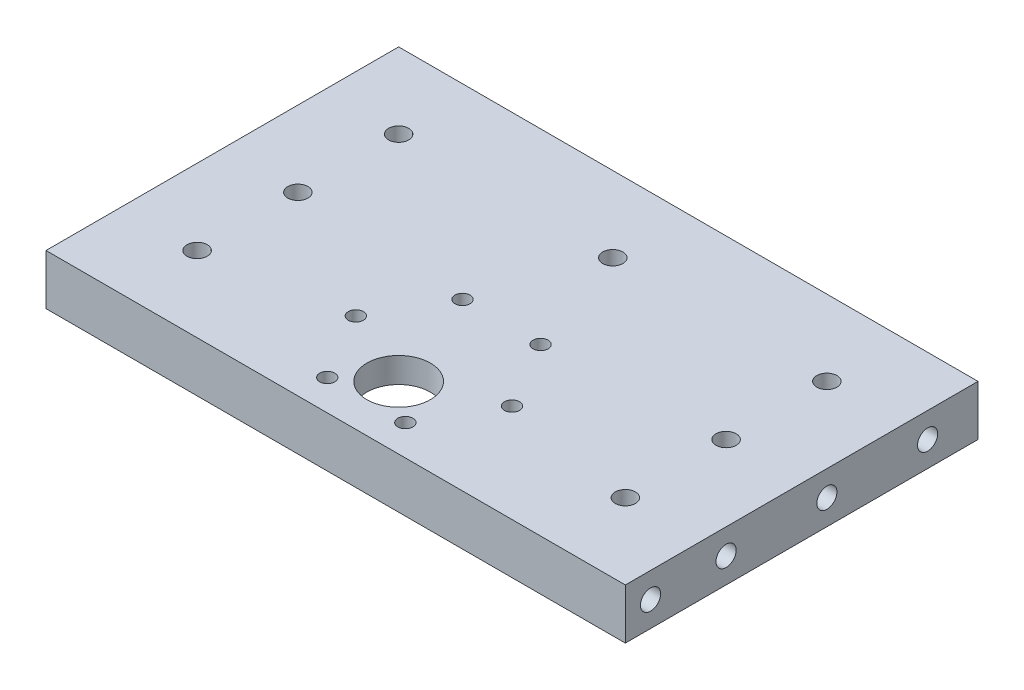
ISO-10303-21;
HEADER;
FILE_DESCRIPTION(('STEP AP214'),'2;1');
FILE_NAME('part.step','',(''),(''),'','','');
FILE_SCHEMA(('AUTOMOTIVE_DESIGN { 1 0 10303 214 1 1 1 1 }'));
ENDSEC;
DATA;
#1=APPLICATION_CONTEXT('core data for automotive mechanical design processes');
#2=APPLICATION_PROTOCOL_DEFINITION('international standard','automotive_design',2000,#1);
#3=PRODUCT_CONTEXT('',#1,'mechanical');
#4=PRODUCT('Part','Part','',(#3));
#5=PRODUCT_RELATED_PRODUCT_CATEGORY('part','',(#4));
#6=PRODUCT_DEFINITION_FORMATION('','',#4);
#7=PRODUCT_DEFINITION_CONTEXT('part definition',#1,'design');
#8=PRODUCT_DEFINITION('design','',#6,#7);
#9=PRODUCT_DEFINITION_SHAPE('','',#8);
#10=(LENGTH_UNIT() NAMED_UNIT(*) SI_UNIT(.MILLI.,.METRE.));
#11=(NAMED_UNIT(*) PLANE_ANGLE_UNIT() SI_UNIT($,.RADIAN.));
#12=(NAMED_UNIT(*) SI_UNIT($,.STERADIAN.) SOLID_ANGLE_UNIT());
#13=UNCERTAINTY_MEASURE_WITH_UNIT(LENGTH_MEASURE(1.E-05),#10,'distance_accuracy_value','');
#14=(GEOMETRIC_REPRESENTATION_CONTEXT(3) GLOBAL_UNCERTAINTY_ASSIGNED_CONTEXT((#13)) GLOBAL_UNIT_ASSIGNED_CONTEXT((#10,
#11,#12)) REPRESENTATION_CONTEXT('',''));
#15=CARTESIAN_POINT('',(0.,0.,0.));
#16=DIRECTION('',(0.,0.,1.));
#17=DIRECTION('',(1.,0.,0.));
#18=AXIS2_PLACEMENT_3D('',#15,#16,#17);
#19=CARTESIAN_POINT('',(0.,0.,22.5));
#20=DIRECTION('',(0.,1.,0.));
#21=DIRECTION('',(0.,0.,1.));
#22=AXIS2_PLACEMENT_3D('',#19,#20,#21);
#23=CYLINDRICAL_SURFACE('',#22,6.3);
#24=CARTESIAN_POINT('',(0.,10.,22.5));
#25=DIRECTION('',(0.,1.,0.));
#26=DIRECTION('',(0.,0.,1.));
#27=AXIS2_PLACEMENT_3D('',#24,#25,#26);
#28=CIRCLE('',#27,6.3);
#29=CARTESIAN_POINT('',(0.,10.,28.8));
#30=VERTEX_POINT('',#29);
#31=EDGE_CURVE('E102',#30,#30,#28,.T.);
#32=ORIENTED_EDGE('',*,*,#31,.T.);
#33=EDGE_LOOP('',(#32));
#34=FACE_BOUND('',#33,.T.);
#35=CARTESIAN_POINT('',(0.,5.,22.5));
#36=DIRECTION('',(0.,-1.,0.));
#37=DIRECTION('',(0.,0.,-1.));
#38=AXIS2_PLACEMENT_3D('',#35,#36,#37);
#39=CIRCLE('',#38,6.3);
#40=CARTESIAN_POINT('',(0.,5.,16.2));
#41=VERTEX_POINT('',#40);
#42=EDGE_CURVE('E120',#41,#41,#39,.F.);
#43=ORIENTED_EDGE('',*,*,#42,.F.);
#44=EDGE_LOOP('',(#43));
#45=FACE_BOUND('',#44,.T.);
#46=ADVANCED_FACE('F33',(#34,#45),#23,.F.);
#47=CARTESIAN_POINT('',(15.5,0.,15.5));
#48=DIRECTION('',(0.,1.,0.));
#49=DIRECTION('',(0.,0.,1.));
#50=AXIS2_PLACEMENT_3D('',#47,#48,#49);
#51=CYLINDRICAL_SURFACE('',#50,1.5);
#52=CARTESIAN_POINT('',(15.5,10.,15.5));
#53=DIRECTION('',(0.,1.,0.));
#54=DIRECTION('',(0.,0.,1.));
#55=AXIS2_PLACEMENT_3D('',#52,#53,#54);
#56=CIRCLE('',#55,1.5);
#57=CARTESIAN_POINT('',(15.5,10.,17.));
#58=VERTEX_POINT('',#57);
#59=EDGE_CURVE('E115',#58,#58,#56,.T.);
#60=ORIENTED_EDGE('',*,*,#59,.T.);
#61=EDGE_LOOP('',(#60));
#62=FACE_BOUND('',#61,.T.);
#63=CARTESIAN_POINT('',(15.5,5.,15.5));
#64=DIRECTION('',(0.,-1.,0.));
#65=DIRECTION('',(0.,0.,-1.));
#66=AXIS2_PLACEMENT_3D('',#63,#64,#65);
#67=CIRCLE('',#66,1.5);
#68=CARTESIAN_POINT('',(15.5,5.,14.));
#69=VERTEX_POINT('',#68);
#70=EDGE_CURVE('E136',#69,#69,#67,.F.);
#71=ORIENTED_EDGE('',*,*,#70,.F.);
#72=EDGE_LOOP('',(#71));
#73=FACE_BOUND('',#72,.T.);
#74=ADVANCED_FACE('F298',(#62,#73),#51,.F.);
#75=CARTESIAN_POINT('',(7.74999999999997,0.,28.9233937586588));
#76=DIRECTION('',(0.,1.,0.));
#77=DIRECTION('',(0.,0.,1.));
#78=AXIS2_PLACEMENT_3D('',#75,#76,#77);
#79=CYLINDRICAL_SURFACE('',#78,1.5);
#80=CARTESIAN_POINT('',(7.74999999999997,10.,28.9233937586588));
#81=DIRECTION('',(0.,1.,0.));
#82=DIRECTION('',(0.,0.,1.));
#83=AXIS2_PLACEMENT_3D('',#80,#81,#82);
#84=CIRCLE('',#83,1.5);
#85=CARTESIAN_POINT('',(7.74999999999997,10.,30.4233937586588));
#86=VERTEX_POINT('',#85);
#87=EDGE_CURVE('E129',#86,#86,#84,.T.);
#88=ORIENTED_EDGE('',*,*,#87,.T.);
#89=EDGE_LOOP('',(#88));
#90=FACE_BOUND('',#89,.T.);
#91=CARTESIAN_POINT('',(7.74999999999997,5.,28.9233937586588));
#92=DIRECTION('',(0.,-1.,0.));
#93=DIRECTION('',(0.,0.,-1.));
#94=AXIS2_PLACEMENT_3D('',#91,#92,#93);
#95=CIRCLE('',#94,1.5);
#96=CARTESIAN_POINT('',(7.74999999999997,5.,27.4233937586588));
#97=VERTEX_POINT('',#96);
#98=EDGE_CURVE('E139',#97,#97,#95,.F.);
#99=ORIENTED_EDGE('',*,*,#98,.F.);
#100=EDGE_LOOP('',(#99));
#101=FACE_BOUND('',#100,.T.);
#102=ADVANCED_FACE('F304',(#90,#101),#79,.F.);
#103=CARTESIAN_POINT('',(-7.75000000000006,0.,28.9233937586588));
#104=DIRECTION('',(0.,1.,0.));
#105=DIRECTION('',(0.,0.,1.));
#106=AXIS2_PLACEMENT_3D('',#103,#104,#105);
#107=CYLINDRICAL_SURFACE('',#106,1.5);
#108=CARTESIAN_POINT('',(-7.75000000000006,10.,28.9233937586588));
#109=DIRECTION('',(0.,1.,0.));
#110=DIRECTION('',(0.,0.,1.));
#111=AXIS2_PLACEMENT_3D('',#108,#109,#110);
#112=CIRCLE('',#111,1.5);
#113=CARTESIAN_POINT('',(-7.75000000000006,10.,30.4233937586588));
#114=VERTEX_POINT('',#113);
#115=EDGE_CURVE('E126',#114,#114,#112,.T.);
#116=ORIENTED_EDGE('',*,*,#115,.T.);
#117=EDGE_LOOP('',(#116));
#118=FACE_BOUND('',#117,.T.);
#119=CARTESIAN_POINT('',(-7.75000000000006,5.,28.9233937586588));
#120=DIRECTION('',(0.,-1.,0.));
#121=DIRECTION('',(0.,0.,-1.));
#122=AXIS2_PLACEMENT_3D('',#119,#120,#121);
#123=CIRCLE('',#122,1.5);
#124=CARTESIAN_POINT('',(-7.75000000000006,5.,27.4233937586588));
#125=VERTEX_POINT('',#124);
#126=EDGE_CURVE('E142',#125,#125,#123,.F.);
#127=ORIENTED_EDGE('',*,*,#126,.F.);
#128=EDGE_LOOP('',(#127));
#129=FACE_BOUND('',#128,.T.);
#130=ADVANCED_FACE('F466',(#118,#129),#107,.F.);
#131=CARTESIAN_POINT('',(-15.5,0.,15.4999999999999));
#132=DIRECTION('',(0.,1.,0.));
#133=DIRECTION('',(0.,0.,1.));
#134=AXIS2_PLACEMENT_3D('',#131,#132,#133);
#135=CYLINDRICAL_SURFACE('',#134,1.5);
#136=CARTESIAN_POINT('',(-15.5,10.,15.4999999999999));
#137=DIRECTION('',(0.,1.,0.));
#138=DIRECTION('',(0.,0.,1.));
#139=AXIS2_PLACEMENT_3D('',#136,#137,#138);
#140=CIRCLE('',#139,1.5);
#141=CARTESIAN_POINT('',(-15.5,10.,16.9999999999999));
#142=VERTEX_POINT('',#141);
#143=EDGE_CURVE('E123',#142,#142,#140,.T.);
#144=ORIENTED_EDGE('',*,*,#143,.T.);
#145=EDGE_LOOP('',(#144));
#146=FACE_BOUND('',#145,.T.);
#147=CARTESIAN_POINT('',(-15.5,5.,15.4999999999999));
#148=DIRECTION('',(0.,-1.,0.));
#149=DIRECTION('',(0.,0.,-1.));
#150=AXIS2_PLACEMENT_3D('',#147,#148,#149);
#151=CIRCLE('',#150,1.5);
#152=CARTESIAN_POINT('',(-15.5,5.,13.9999999999999));
#153=VERTEX_POINT('',#152);
#154=EDGE_CURVE('E145',#153,#153,#151,.F.);
#155=ORIENTED_EDGE('',*,*,#154,.F.);
#156=EDGE_LOOP('',(#155));
#157=FACE_BOUND('',#156,.T.);
#158=ADVANCED_FACE('F473',(#146,#157),#135,.F.);
#159=CARTESIAN_POINT('',(-7.74999999999987,0.,2.07660624134112));
#160=DIRECTION('',(0.,1.,0.));
#161=DIRECTION('',(0.,0.,1.));
#162=AXIS2_PLACEMENT_3D('',#159,#160,#161);
#163=CYLINDRICAL_SURFACE('',#162,1.5);
#164=CARTESIAN_POINT('',(-7.74999999999987,10.,2.07660624134112));
#165=DIRECTION('',(0.,1.,0.));
#166=DIRECTION('',(0.,0.,1.));
#167=AXIS2_PLACEMENT_3D('',#164,#165,#166);
#168=CIRCLE('',#167,1.5);
#169=CARTESIAN_POINT('',(-7.74999999999987,10.,3.57660624134112));
#170=VERTEX_POINT('',#169);
#171=EDGE_CURVE('E119',#170,#170,#168,.T.);
#172=ORIENTED_EDGE('',*,*,#171,.T.);
#173=EDGE_LOOP('',(#172));
#174=FACE_BOUND('',#173,.T.);
#175=CARTESIAN_POINT('',(-7.74999999999987,5.,2.07660624134112));
#176=DIRECTION('',(0.,-1.,0.));
#177=DIRECTION('',(0.,0.,-1.));
#178=AXIS2_PLACEMENT_3D('',#175,#176,#177);
#179=CIRCLE('',#178,1.5);
#180=CARTESIAN_POINT('',(-7.74999999999987,5.,0.576606241341121));
#181=VERTEX_POINT('',#180);
#182=EDGE_CURVE('E148',#181,#181,#179,.F.);
#183=ORIENTED_EDGE('',*,*,#182,.F.);
#184=EDGE_LOOP('',(#183));
#185=FACE_BOUND('',#184,.T.);
#186=ADVANCED_FACE('F327',(#174,#185),#163,.F.);
#187=CARTESIAN_POINT('',(7.75000000000016,0.,2.07660624134128));
#188=DIRECTION('',(0.,1.,0.));
#189=DIRECTION('',(0.,0.,1.));
#190=AXIS2_PLACEMENT_3D('',#187,#188,#189);
#191=CYLINDRICAL_SURFACE('',#190,1.5);
#192=CARTESIAN_POINT('',(7.75000000000016,10.,2.07660624134128));
#193=DIRECTION('',(0.,1.,0.));
#194=DIRECTION('',(0.,0.,1.));
#195=AXIS2_PLACEMENT_3D('',#192,#193,#194);
#196=CIRCLE('',#195,1.5);
#197=CARTESIAN_POINT('',(7.75000000000016,10.,3.57660624134128));
#198=VERTEX_POINT('',#197);
#199=EDGE_CURVE('E116',#198,#198,#196,.T.);
#200=ORIENTED_EDGE('',*,*,#199,.T.);
#201=EDGE_LOOP('',(#200));
#202=FACE_BOUND('',#201,.T.);
#203=CARTESIAN_POINT('',(7.75000000000016,5.,2.07660624134128));
#204=DIRECTION('',(0.,-1.,0.));
#205=DIRECTION('',(0.,0.,-1.));
#206=AXIS2_PLACEMENT_3D('',#203,#204,#205);
#207=CIRCLE('',#206,1.5);
#208=CARTESIAN_POINT('',(7.75000000000016,5.,0.576606241341277));
#209=VERTEX_POINT('',#208);
#210=EDGE_CURVE('E37',#209,#209,#207,.F.);
#211=ORIENTED_EDGE('',*,*,#210,.F.);
#212=EDGE_LOOP('',(#211));
#213=FACE_BOUND('',#212,.T.);
#214=ADVANCED_FACE('F309',(#202,#213),#191,.F.);
#215=CARTESIAN_POINT('',(-57.5,10.,-35.));
#216=DIRECTION('',(1.,0.,0.));
#217=DIRECTION('',(0.,0.,-1.));
#218=AXIS2_PLACEMENT_3D('',#215,#216,#217);
#219=PLANE('',#218);
#220=CARTESIAN_POINT('',(-57.5,5.00000000000001,30.));
#221=DIRECTION('',(-1.,0.,0.));
#222=DIRECTION('',(0.,0.,1.));
#223=AXIS2_PLACEMENT_3D('',#220,#221,#222);
#224=CIRCLE('',#223,2.00000000000001);
#225=CARTESIAN_POINT('',(-57.5,5.00000000000001,32.));
#226=VERTEX_POINT('',#225);
#227=EDGE_CURVE('E177',#226,#226,#224,.T.);
#228=ORIENTED_EDGE('',*,*,#227,.F.);
#229=EDGE_LOOP('',(#228));
#230=FACE_BOUND('',#229,.T.);
#231=CARTESIAN_POINT('',(-57.5,5.00000000000001,15.));
#232=DIRECTION('',(-1.,0.,0.));
#233=DIRECTION('',(0.,0.,1.));
#234=AXIS2_PLACEMENT_3D('',#231,#232,#233);
#235=CIRCLE('',#234,2.);
#236=CARTESIAN_POINT('',(-57.5,5.00000000000001,17.));
#237=VERTEX_POINT('',#236);
#238=EDGE_CURVE('E171',#237,#237,#235,.T.);
#239=ORIENTED_EDGE('',*,*,#238,.F.);
#240=EDGE_LOOP('',(#239));
#241=FACE_BOUND('',#240,.T.);
#242=CARTESIAN_POINT('',(-57.5,5.,-5.00000000000001));
#243=DIRECTION('',(-1.,0.,0.));
#244=DIRECTION('',(0.,0.,1.));
#245=AXIS2_PLACEMENT_3D('',#242,#243,#244);
#246=CIRCLE('',#245,2.);
#247=CARTESIAN_POINT('',(-57.5,5.,-3.00000000000001));
#248=VERTEX_POINT('',#247);
#249=EDGE_CURVE('E165',#248,#248,#246,.T.);
#250=ORIENTED_EDGE('',*,*,#249,.F.);
#251=EDGE_LOOP('',(#250));
#252=FACE_BOUND('',#251,.T.);
#253=CARTESIAN_POINT('',(-57.5,5.,-25.));
#254=DIRECTION('',(-1.,0.,0.));
#255=DIRECTION('',(0.,0.,1.));
#256=AXIS2_PLACEMENT_3D('',#253,#254,#255);
#257=CIRCLE('',#256,2.);
#258=CARTESIAN_POINT('',(-57.5,5.,-23.));
#259=VERTEX_POINT('',#258);
#260=EDGE_CURVE('E158',#259,#259,#257,.T.);
#261=ORIENTED_EDGE('',*,*,#260,.F.);
#262=EDGE_LOOP('',(#261));
#263=FACE_BOUND('',#262,.T.);
#264=DIRECTION('',(0.,0.,1.));
#265=VECTOR('',#264,1.);
#266=CARTESIAN_POINT('',(-57.5,0.,-35.));
#267=LINE('',#266,#265);
#268=CARTESIAN_POINT('',(-57.5,0.,-35.));
#269=VERTEX_POINT('',#268);
#270=CARTESIAN_POINT('',(-57.5,0.,35.));
#271=VERTEX_POINT('',#270);
#272=EDGE_CURVE('E99',#269,#271,#267,.T.);
#273=ORIENTED_EDGE('',*,*,#272,.T.);
#274=DIRECTION('',(0.,-1.,0.));
#275=VECTOR('',#274,1.);
#276=CARTESIAN_POINT('',(-57.5,10.,35.));
#277=LINE('',#276,#275);
#278=CARTESIAN_POINT('',(-57.5,10.,35.));
#279=VERTEX_POINT('',#278);
#280=EDGE_CURVE('E11',#279,#271,#277,.T.);
#281=ORIENTED_EDGE('',*,*,#280,.F.);
#282=DIRECTION('',(0.,0.,1.));
#283=VECTOR('',#282,1.);
#284=CARTESIAN_POINT('',(-57.5,10.,-35.));
#285=LINE('',#284,#283);
#286=CARTESIAN_POINT('',(-57.5,10.,-35.));
#287=VERTEX_POINT('',#286);
#288=EDGE_CURVE('E86',#287,#279,#285,.T.);
#289=ORIENTED_EDGE('',*,*,#288,.F.);
#290=DIRECTION('',(0.,-1.,0.));
#291=VECTOR('',#290,1.);
#292=CARTESIAN_POINT('',(-57.5,10.,-35.));
#293=LINE('',#292,#291);
#294=EDGE_CURVE('E95',#287,#269,#293,.T.);
#295=ORIENTED_EDGE('',*,*,#294,.T.);
#296=EDGE_LOOP('',(#273,#281,#289,#295));
#297=FACE_BOUND('',#296,.T.);
#298=ADVANCED_FACE('F35',(#230,#241,#252,#263,#297),#219,.F.);
#299=CARTESIAN_POINT('',(-57.5,10.,35.));
#300=DIRECTION('',(0.,0.,-1.));
#301=DIRECTION('',(-1.,0.,0.));
#302=AXIS2_PLACEMENT_3D('',#299,#300,#301);
#303=PLANE('',#302);
#304=DIRECTION('',(1.,0.,0.));
#305=VECTOR('',#304,1.);
#306=CARTESIAN_POINT('',(-57.5,0.,35.));
#307=LINE('',#306,#305);
#308=CARTESIAN_POINT('',(57.5,0.,35.));
#309=VERTEX_POINT('',#308);
#310=EDGE_CURVE('E90',#271,#309,#307,.T.);
#311=ORIENTED_EDGE('',*,*,#310,.T.);
#312=DIRECTION('',(0.,-1.,0.));
#313=VECTOR('',#312,1.);
#314=CARTESIAN_POINT('',(57.5,10.,35.));
#315=LINE('',#314,#313);
#316=CARTESIAN_POINT('',(57.5,10.,35.));
#317=VERTEX_POINT('',#316);
#318=EDGE_CURVE('E43',#317,#309,#315,.T.);
#319=ORIENTED_EDGE('',*,*,#318,.F.);
#320=DIRECTION('',(1.,0.,0.));
#321=VECTOR('',#320,1.);
#322=CARTESIAN_POINT('',(-57.5,10.,35.));
#323=LINE('',#322,#321);
#324=EDGE_CURVE('E81',#279,#317,#323,.T.);
#325=ORIENTED_EDGE('',*,*,#324,.F.);
#326=ORIENTED_EDGE('',*,*,#280,.T.);
#327=EDGE_LOOP('',(#311,#319,#325,#326));
#328=FACE_BOUND('',#327,.T.);
#329=ADVANCED_FACE('F89',(#328),#303,.F.);
#330=CARTESIAN_POINT('',(57.5,10.,-35.));
#331=DIRECTION('',(-1.,0.,0.));
#332=DIRECTION('',(0.,0.,1.));
#333=AXIS2_PLACEMENT_3D('',#330,#331,#332);
#334=PLANE('',#333);
#335=CARTESIAN_POINT('',(57.5,5.00000000000001,30.));
#336=DIRECTION('',(1.,0.,0.));
#337=DIRECTION('',(0.,0.,-1.));
#338=AXIS2_PLACEMENT_3D('',#335,#336,#337);
#339=CIRCLE('',#338,2.00000000000001);
#340=CARTESIAN_POINT('',(57.5,5.00000000000001,28.));
#341=VERTEX_POINT('',#340);
#342=EDGE_CURVE('E201',#341,#341,#339,.T.);
#343=ORIENTED_EDGE('',*,*,#342,.F.);
#344=EDGE_LOOP('',(#343));
#345=FACE_BOUND('',#344,.T.);
#346=CARTESIAN_POINT('',(57.5,5.00000000000001,15.));
#347=DIRECTION('',(1.,0.,0.));
#348=DIRECTION('',(0.,0.,-1.));
#349=AXIS2_PLACEMENT_3D('',#346,#347,#348);
#350=CIRCLE('',#349,2.);
#351=CARTESIAN_POINT('',(57.5,5.00000000000001,13.));
#352=VERTEX_POINT('',#351);
#353=EDGE_CURVE('E195',#352,#352,#350,.T.);
#354=ORIENTED_EDGE('',*,*,#353,.F.);
#355=EDGE_LOOP('',(#354));
#356=FACE_BOUND('',#355,.T.);
#357=CARTESIAN_POINT('',(57.5,5.,-5.00000000000002));
#358=DIRECTION('',(1.,0.,0.));
#359=DIRECTION('',(0.,0.,-1.));
#360=AXIS2_PLACEMENT_3D('',#357,#358,#359);
#361=CIRCLE('',#360,2.);
#362=CARTESIAN_POINT('',(57.5,5.,-7.00000000000002));
#363=VERTEX_POINT('',#362);
#364=EDGE_CURVE('E189',#363,#363,#361,.T.);
#365=ORIENTED_EDGE('',*,*,#364,.F.);
#366=EDGE_LOOP('',(#365));
#367=FACE_BOUND('',#366,.T.);
#368=CARTESIAN_POINT('',(57.5,5.,-25.));
#369=DIRECTION('',(1.,0.,0.));
#370=DIRECTION('',(0.,0.,-1.));
#371=AXIS2_PLACEMENT_3D('',#368,#369,#370);
#372=CIRCLE('',#371,2.);
#373=CARTESIAN_POINT('',(57.5,5.,-27.));
#374=VERTEX_POINT('',#373);
#375=EDGE_CURVE('E182',#374,#374,#372,.T.);
#376=ORIENTED_EDGE('',*,*,#375,.F.);
#377=EDGE_LOOP('',(#376));
#378=FACE_BOUND('',#377,.T.);
#379=DIRECTION('',(0.,0.,-1.));
#380=VECTOR('',#379,1.);
#381=CARTESIAN_POINT('',(57.5,0.,-35.));
#382=LINE('',#381,#380);
#383=CARTESIAN_POINT('',(57.5,0.,-35.));
#384=VERTEX_POINT('',#383);
#385=EDGE_CURVE('E68',#309,#384,#382,.T.);
#386=ORIENTED_EDGE('',*,*,#385,.T.);
#387=DIRECTION('',(0.,-1.,0.));
#388=VECTOR('',#387,1.);
#389=CARTESIAN_POINT('',(57.5,10.,-35.));
#390=LINE('',#389,#388);
#391=CARTESIAN_POINT('',(57.5,10.,-35.));
#392=VERTEX_POINT('',#391);
#393=EDGE_CURVE('E91',#392,#384,#390,.T.);
#394=ORIENTED_EDGE('',*,*,#393,.F.);
#395=DIRECTION('',(0.,0.,-1.));
#396=VECTOR('',#395,1.);
#397=CARTESIAN_POINT('',(57.5,10.,-35.));
#398=LINE('',#397,#396);
#399=EDGE_CURVE('E84',#317,#392,#398,.T.);
#400=ORIENTED_EDGE('',*,*,#399,.F.);
#401=ORIENTED_EDGE('',*,*,#318,.T.);
#402=EDGE_LOOP('',(#386,#394,#400,#401));
#403=FACE_BOUND('',#402,.T.);
#404=ADVANCED_FACE('F93',(#345,#356,#367,#378,#403),#334,.F.);
#405=CARTESIAN_POINT('',(-57.5,10.,-35.));
#406=DIRECTION('',(0.,0.,1.));
#407=DIRECTION('',(1.,0.,0.));
#408=AXIS2_PLACEMENT_3D('',#405,#406,#407);
#409=PLANE('',#408);
#410=CARTESIAN_POINT('',(52.5,5.,-35.));
#411=DIRECTION('',(0.,0.,-1.));
#412=DIRECTION('',(-1.,0.,0.));
#413=AXIS2_PLACEMENT_3D('',#410,#411,#412);
#414=CIRCLE('',#413,2.);
#415=CARTESIAN_POINT('',(50.5,5.,-35.));
#416=VERTEX_POINT('',#415);
#417=EDGE_CURVE('E213',#416,#416,#414,.T.);
#418=ORIENTED_EDGE('',*,*,#417,.F.);
#419=EDGE_LOOP('',(#418));
#420=FACE_BOUND('',#419,.T.);
#421=CARTESIAN_POINT('',(-52.5,4.99999999999999,-35.));
#422=DIRECTION('',(0.,0.,-1.));
#423=DIRECTION('',(-1.,0.,0.));
#424=AXIS2_PLACEMENT_3D('',#421,#422,#423);
#425=CIRCLE('',#424,2.);
#426=CARTESIAN_POINT('',(-54.5,4.99999999999999,-35.));
#427=VERTEX_POINT('',#426);
#428=EDGE_CURVE('E206',#427,#427,#425,.T.);
#429=ORIENTED_EDGE('',*,*,#428,.F.);
#430=EDGE_LOOP('',(#429));
#431=FACE_BOUND('',#430,.T.);
#432=DIRECTION('',(-1.,0.,0.));
#433=VECTOR('',#432,1.);
#434=CARTESIAN_POINT('',(-57.5,0.,-35.));
#435=LINE('',#434,#433);
#436=EDGE_CURVE('E74',#384,#269,#435,.T.);
#437=ORIENTED_EDGE('',*,*,#436,.T.);
#438=ORIENTED_EDGE('',*,*,#294,.F.);
#439=DIRECTION('',(-1.,0.,0.));
#440=VECTOR('',#439,1.);
#441=CARTESIAN_POINT('',(-57.5,10.,-35.));
#442=LINE('',#441,#440);
#443=EDGE_CURVE('E51',#392,#287,#442,.T.);
#444=ORIENTED_EDGE('',*,*,#443,.F.);
#445=ORIENTED_EDGE('',*,*,#393,.T.);
#446=EDGE_LOOP('',(#437,#438,#444,#445));
#447=FACE_BOUND('',#446,.T.);
#448=ADVANCED_FACE('F107',(#420,#431,#447),#409,.F.);
#449=CARTESIAN_POINT('',(0.,10.,0.));
#450=DIRECTION('',(0.,1.,0.));
#451=DIRECTION('',(0.,0.,1.));
#452=AXIS2_PLACEMENT_3D('',#449,#450,#451);
#453=PLANE('',#452);
#454=CARTESIAN_POINT('',(42.5,10.,-20.));
#455=DIRECTION('',(0.,-1.,0.));
#456=DIRECTION('',(0.,0.,-1.));
#457=AXIS2_PLACEMENT_3D('',#454,#455,#456);
#458=CIRCLE('',#457,2.);
#459=CARTESIAN_POINT('',(42.5,10.,-22.));
#460=VERTEX_POINT('',#459);
#461=EDGE_CURVE('E221',#460,#460,#458,.T.);
#462=ORIENTED_EDGE('',*,*,#461,.T.);
#463=EDGE_LOOP('',(#462));
#464=FACE_BOUND('',#463,.T.);
#465=CARTESIAN_POINT('',(42.5,10.,20.));
#466=DIRECTION('',(0.,-1.,0.));
#467=DIRECTION('',(0.,0.,-1.));
#468=AXIS2_PLACEMENT_3D('',#465,#466,#467);
#469=CIRCLE('',#468,2.);
#470=CARTESIAN_POINT('',(42.5,10.,18.));
#471=VERTEX_POINT('',#470);
#472=EDGE_CURVE('E240',#471,#471,#469,.T.);
#473=ORIENTED_EDGE('',*,*,#472,.T.);
#474=EDGE_LOOP('',(#473));
#475=FACE_BOUND('',#474,.T.);
#476=CARTESIAN_POINT('',(-42.5,10.,-20.));
#477=DIRECTION('',(0.,-1.,0.));
#478=DIRECTION('',(0.,0.,-1.));
#479=AXIS2_PLACEMENT_3D('',#476,#477,#478);
#480=CIRCLE('',#479,2.);
#481=CARTESIAN_POINT('',(-42.5,10.,-22.));
#482=VERTEX_POINT('',#481);
#483=EDGE_CURVE('E234',#482,#482,#480,.T.);
#484=ORIENTED_EDGE('',*,*,#483,.T.);
#485=EDGE_LOOP('',(#484));
#486=FACE_BOUND('',#485,.T.);
#487=CARTESIAN_POINT('',(-42.5,10.,0.));
#488=DIRECTION('',(0.,-1.,0.));
#489=DIRECTION('',(0.,0.,-1.));
#490=AXIS2_PLACEMENT_3D('',#487,#488,#489);
#491=CIRCLE('',#490,2.);
#492=CARTESIAN_POINT('',(-42.5,10.,-2.00000000000001));
#493=VERTEX_POINT('',#492);
#494=EDGE_CURVE('E227',#493,#493,#491,.T.);
#495=ORIENTED_EDGE('',*,*,#494,.T.);
#496=EDGE_LOOP('',(#495));
#497=FACE_BOUND('',#496,.T.);
#498=CARTESIAN_POINT('',(-42.5,10.,20.));
#499=DIRECTION('',(0.,-1.,0.));
#500=DIRECTION('',(0.,0.,-1.));
#501=AXIS2_PLACEMENT_3D('',#498,#499,#500);
#502=CIRCLE('',#501,2.);
#503=CARTESIAN_POINT('',(-42.5,10.,18.));
#504=VERTEX_POINT('',#503);
#505=EDGE_CURVE('E228',#504,#504,#502,.T.);
#506=ORIENTED_EDGE('',*,*,#505,.T.);
#507=EDGE_LOOP('',(#506));
#508=FACE_BOUND('',#507,.T.);
#509=CARTESIAN_POINT('',(0.,10.,-20.));
#510=DIRECTION('',(0.,-1.,0.));
#511=DIRECTION('',(0.,0.,-1.));
#512=AXIS2_PLACEMENT_3D('',#509,#510,#511);
#513=CIRCLE('',#512,2.);
#514=CARTESIAN_POINT('',(0.,10.,-22.));
#515=VERTEX_POINT('',#514);
#516=EDGE_CURVE('E251',#515,#515,#513,.T.);
#517=ORIENTED_EDGE('',*,*,#516,.T.);
#518=EDGE_LOOP('',(#517));
#519=FACE_BOUND('',#518,.T.);
#520=CARTESIAN_POINT('',(42.5,10.,0.));
#521=DIRECTION('',(0.,-1.,0.));
#522=DIRECTION('',(0.,0.,-1.));
#523=AXIS2_PLACEMENT_3D('',#520,#521,#522);
#524=CIRCLE('',#523,2.);
#525=CARTESIAN_POINT('',(42.5,10.,-2.00000000000001));
#526=VERTEX_POINT('',#525);
#527=EDGE_CURVE('E210',#526,#526,#524,.T.);
#528=ORIENTED_EDGE('',*,*,#527,.T.);
#529=EDGE_LOOP('',(#528));
#530=FACE_BOUND('',#529,.T.);
#531=ORIENTED_EDGE('',*,*,#199,.F.);
#532=EDGE_LOOP('',(#531));
#533=FACE_BOUND('',#532,.T.);
#534=ORIENTED_EDGE('',*,*,#171,.F.);
#535=EDGE_LOOP('',(#534));
#536=FACE_BOUND('',#535,.T.);
#537=ORIENTED_EDGE('',*,*,#143,.F.);
#538=EDGE_LOOP('',(#537));
#539=FACE_BOUND('',#538,.T.);
#540=ORIENTED_EDGE('',*,*,#115,.F.);
#541=EDGE_LOOP('',(#540));
#542=FACE_BOUND('',#541,.T.);
#543=ORIENTED_EDGE('',*,*,#87,.F.);
#544=EDGE_LOOP('',(#543));
#545=FACE_BOUND('',#544,.T.);
#546=ORIENTED_EDGE('',*,*,#59,.F.);
#547=EDGE_LOOP('',(#546));
#548=FACE_BOUND('',#547,.T.);
#549=ORIENTED_EDGE('',*,*,#31,.F.);
#550=EDGE_LOOP('',(#549));
#551=FACE_BOUND('',#550,.T.);
#552=ORIENTED_EDGE('',*,*,#288,.T.);
#553=ORIENTED_EDGE('',*,*,#324,.T.);
#554=ORIENTED_EDGE('',*,*,#399,.T.);
#555=ORIENTED_EDGE('',*,*,#443,.T.);
#556=EDGE_LOOP('',(#552,#553,#554,#555));
#557=FACE_BOUND('',#556,.T.);
#558=ADVANCED_FACE('F82',(#464,#475,#486,#497,#508,#519,#530,#533,#536,#539,#542,#545,#548,#551,
#557),#453,.T.);
#559=CARTESIAN_POINT('',(0.,0.,0.));
#560=DIRECTION('',(0.,1.,0.));
#561=DIRECTION('',(0.,0.,1.));
#562=AXIS2_PLACEMENT_3D('',#559,#560,#561);
#563=PLANE('',#562);
#564=CARTESIAN_POINT('',(42.5,0.,-20.));
#565=DIRECTION('',(0.,-1.,0.));
#566=DIRECTION('',(0.,0.,-1.));
#567=AXIS2_PLACEMENT_3D('',#564,#565,#566);
#568=CIRCLE('',#567,2.);
#569=CARTESIAN_POINT('',(42.5,0.,-22.));
#570=VERTEX_POINT('',#569);
#571=EDGE_CURVE('E243',#570,#570,#568,.T.);
#572=ORIENTED_EDGE('',*,*,#571,.F.);
#573=EDGE_LOOP('',(#572));
#574=FACE_BOUND('',#573,.T.);
#575=CARTESIAN_POINT('',(42.5,0.,20.));
#576=DIRECTION('',(0.,-1.,0.));
#577=DIRECTION('',(0.,0.,-1.));
#578=AXIS2_PLACEMENT_3D('',#575,#576,#577);
#579=CIRCLE('',#578,2.);
#580=CARTESIAN_POINT('',(42.5,0.,18.));
#581=VERTEX_POINT('',#580);
#582=EDGE_CURVE('E237',#581,#581,#579,.T.);
#583=ORIENTED_EDGE('',*,*,#582,.F.);
#584=EDGE_LOOP('',(#583));
#585=FACE_BOUND('',#584,.T.);
#586=CARTESIAN_POINT('',(-42.5,0.,-20.));
#587=DIRECTION('',(0.,-1.,0.));
#588=DIRECTION('',(0.,0.,-1.));
#589=AXIS2_PLACEMENT_3D('',#586,#587,#588);
#590=CIRCLE('',#589,2.);
#591=CARTESIAN_POINT('',(-42.5,0.,-22.));
#592=VERTEX_POINT('',#591);
#593=EDGE_CURVE('E231',#592,#592,#590,.T.);
#594=ORIENTED_EDGE('',*,*,#593,.F.);
#595=EDGE_LOOP('',(#594));
#596=FACE_BOUND('',#595,.T.);
#597=CARTESIAN_POINT('',(-42.5,0.,0.));
#598=DIRECTION('',(0.,-1.,0.));
#599=DIRECTION('',(0.,0.,-1.));
#600=AXIS2_PLACEMENT_3D('',#597,#598,#599);
#601=CIRCLE('',#600,2.);
#602=CARTESIAN_POINT('',(-42.5,0.,-2.00000000000001));
#603=VERTEX_POINT('',#602);
#604=EDGE_CURVE('E224',#603,#603,#601,.T.);
#605=ORIENTED_EDGE('',*,*,#604,.F.);
#606=EDGE_LOOP('',(#605));
#607=FACE_BOUND('',#606,.T.);
#608=CARTESIAN_POINT('',(-42.5,0.,20.));
#609=DIRECTION('',(0.,-1.,0.));
#610=DIRECTION('',(0.,0.,-1.));
#611=AXIS2_PLACEMENT_3D('',#608,#609,#610);
#612=CIRCLE('',#611,2.);
#613=CARTESIAN_POINT('',(-42.5,0.,18.));
#614=VERTEX_POINT('',#613);
#615=EDGE_CURVE('E254',#614,#614,#612,.T.);
#616=ORIENTED_EDGE('',*,*,#615,.F.);
#617=EDGE_LOOP('',(#616));
#618=FACE_BOUND('',#617,.T.);
#619=CARTESIAN_POINT('',(0.,0.,-20.));
#620=DIRECTION('',(0.,-1.,0.));
#621=DIRECTION('',(0.,0.,-1.));
#622=AXIS2_PLACEMENT_3D('',#619,#620,#621);
#623=CIRCLE('',#622,2.);
#624=CARTESIAN_POINT('',(0.,0.,-22.));
#625=VERTEX_POINT('',#624);
#626=EDGE_CURVE('E248',#625,#625,#623,.T.);
#627=ORIENTED_EDGE('',*,*,#626,.F.);
#628=EDGE_LOOP('',(#627));
#629=FACE_BOUND('',#628,.T.);
#630=CARTESIAN_POINT('',(42.5,0.,0.));
#631=DIRECTION('',(0.,-1.,0.));
#632=DIRECTION('',(0.,0.,-1.));
#633=AXIS2_PLACEMENT_3D('',#630,#631,#632);
#634=CIRCLE('',#633,2.);
#635=CARTESIAN_POINT('',(42.5,0.,-2.00000000000001));
#636=VERTEX_POINT('',#635);
#637=EDGE_CURVE('E218',#636,#636,#634,.T.);
#638=ORIENTED_EDGE('',*,*,#637,.F.);
#639=EDGE_LOOP('',(#638));
#640=FACE_BOUND('',#639,.T.);
#641=CARTESIAN_POINT('',(0.,0.,15.5));
#642=DIRECTION('',(0.,-1.,0.));
#643=DIRECTION('',(0.,0.,-1.));
#644=AXIS2_PLACEMENT_3D('',#641,#642,#643);
#645=CIRCLE('',#644,18.5);
#646=CARTESIAN_POINT('',(0.,0.,-3.00000000000001));
#647=VERTEX_POINT('',#646);
#648=EDGE_CURVE('E151',#647,#647,#645,.T.);
#649=ORIENTED_EDGE('',*,*,#648,.F.);
#650=EDGE_LOOP('',(#649));
#651=FACE_BOUND('',#650,.T.);
#652=ORIENTED_EDGE('',*,*,#272,.F.);
#653=ORIENTED_EDGE('',*,*,#436,.F.);
#654=ORIENTED_EDGE('',*,*,#385,.F.);
#655=ORIENTED_EDGE('',*,*,#310,.F.);
#656=EDGE_LOOP('',(#652,#653,#654,#655));
#657=FACE_BOUND('',#656,.T.);
#658=ADVANCED_FACE('F110',(#574,#585,#596,#607,#618,#629,#640,#651,#657),#563,.F.);
#659=CARTESIAN_POINT('',(0.,5.,15.5));
#660=DIRECTION('',(0.,-1.,0.));
#661=DIRECTION('',(0.,0.,-1.));
#662=AXIS2_PLACEMENT_3D('',#659,#660,#661);
#663=PLANE('',#662);
#664=CARTESIAN_POINT('',(0.,5.,15.5));
#665=DIRECTION('',(0.,-1.,0.));
#666=DIRECTION('',(0.,0.,-1.));
#667=AXIS2_PLACEMENT_3D('',#664,#665,#666);
#668=CIRCLE('',#667,18.5);
#669=CARTESIAN_POINT('',(0.,5.,-3.00000000000001));
#670=VERTEX_POINT('',#669);
#671=EDGE_CURVE('E154',#670,#670,#668,.T.);
#672=ORIENTED_EDGE('',*,*,#671,.T.);
#673=EDGE_LOOP('',(#672));
#674=FACE_BOUND('',#673,.T.);
#675=ORIENTED_EDGE('',*,*,#210,.T.);
#676=EDGE_LOOP('',(#675));
#677=FACE_BOUND('',#676,.T.);
#678=ORIENTED_EDGE('',*,*,#182,.T.);
#679=EDGE_LOOP('',(#678));
#680=FACE_BOUND('',#679,.T.);
#681=ORIENTED_EDGE('',*,*,#154,.T.);
#682=EDGE_LOOP('',(#681));
#683=FACE_BOUND('',#682,.T.);
#684=ORIENTED_EDGE('',*,*,#126,.T.);
#685=EDGE_LOOP('',(#684));
#686=FACE_BOUND('',#685,.T.);
#687=ORIENTED_EDGE('',*,*,#98,.T.);
#688=EDGE_LOOP('',(#687));
#689=FACE_BOUND('',#688,.T.);
#690=ORIENTED_EDGE('',*,*,#70,.T.);
#691=EDGE_LOOP('',(#690));
#692=FACE_BOUND('',#691,.T.);
#693=ORIENTED_EDGE('',*,*,#42,.T.);
#694=EDGE_LOOP('',(#693));
#695=FACE_BOUND('',#694,.T.);
#696=ADVANCED_FACE('F272',(#674,#677,#680,#683,#686,#689,#692,#695),#663,.T.);
#697=CARTESIAN_POINT('',(0.,5.,15.5));
#698=DIRECTION('',(0.,-1.,0.));
#699=DIRECTION('',(0.,0.,-1.));
#700=AXIS2_PLACEMENT_3D('',#697,#698,#699);
#701=CYLINDRICAL_SURFACE('',#700,18.5);
#702=ORIENTED_EDGE('',*,*,#671,.F.);
#703=EDGE_LOOP('',(#702));
#704=FACE_BOUND('',#703,.T.);
#705=ORIENTED_EDGE('',*,*,#648,.T.);
#706=EDGE_LOOP('',(#705));
#707=FACE_BOUND('',#706,.T.);
#708=ADVANCED_FACE('F281',(#704,#707),#701,.F.);
#709=CARTESIAN_POINT('',(-47.5,5.,-25.));
#710=DIRECTION('',(-1.,0.,0.));
#711=DIRECTION('',(0.,0.,1.));
#712=AXIS2_PLACEMENT_3D('',#709,#710,#711);
#713=CYLINDRICAL_SURFACE('',#712,2.);
#714=CARTESIAN_POINT('',(-47.5,5.,-25.));
#715=DIRECTION('',(-1.,0.,0.));
#716=DIRECTION('',(0.,0.,1.));
#717=AXIS2_PLACEMENT_3D('',#714,#715,#716);
#718=CIRCLE('',#717,2.);
#719=CARTESIAN_POINT('',(-47.5,5.,-23.));
#720=VERTEX_POINT('',#719);
#721=EDGE_CURVE('E161',#720,#720,#718,.T.);
#722=ORIENTED_EDGE('',*,*,#721,.F.);
#723=EDGE_LOOP('',(#722));
#724=FACE_BOUND('',#723,.T.);
#725=ORIENTED_EDGE('',*,*,#260,.T.);
#726=EDGE_LOOP('',(#725));
#727=FACE_BOUND('',#726,.T.);
#728=ADVANCED_FACE('F283',(#724,#727),#713,.F.);
#729=CARTESIAN_POINT('',(-47.5,5.,-25.));
#730=DIRECTION('',(-1.,0.,0.));
#731=DIRECTION('',(0.,0.,1.));
#732=AXIS2_PLACEMENT_3D('',#729,#730,#731);
#733=PLANE('',#732);
#734=ORIENTED_EDGE('',*,*,#721,.T.);
#735=EDGE_LOOP('',(#734));
#736=FACE_BOUND('',#735,.T.);
#737=ADVANCED_FACE('F290',(#736),#733,.T.);
#738=CARTESIAN_POINT('',(-47.5,5.,-5.00000000000001));
#739=DIRECTION('',(-1.,0.,0.));
#740=DIRECTION('',(0.,0.,1.));
#741=AXIS2_PLACEMENT_3D('',#738,#739,#740);
#742=CYLINDRICAL_SURFACE('',#741,2.);
#743=CARTESIAN_POINT('',(-47.5,5.,-5.00000000000001));
#744=DIRECTION('',(-1.,0.,0.));
#745=DIRECTION('',(0.,0.,1.));
#746=AXIS2_PLACEMENT_3D('',#743,#744,#745);
#747=CIRCLE('',#746,2.);
#748=CARTESIAN_POINT('',(-47.5,5.,-3.00000000000001));
#749=VERTEX_POINT('',#748);
#750=EDGE_CURVE('E168',#749,#749,#747,.T.);
#751=ORIENTED_EDGE('',*,*,#750,.F.);
#752=EDGE_LOOP('',(#751));
#753=FACE_BOUND('',#752,.T.);
#754=ORIENTED_EDGE('',*,*,#249,.T.);
#755=EDGE_LOOP('',(#754));
#756=FACE_BOUND('',#755,.T.);
#757=ADVANCED_FACE('F338',(#753,#756),#742,.F.);
#758=CARTESIAN_POINT('',(-47.5,5.,-5.00000000000001));
#759=DIRECTION('',(-1.,0.,0.));
#760=DIRECTION('',(0.,0.,1.));
#761=AXIS2_PLACEMENT_3D('',#758,#759,#760);
#762=PLANE('',#761);
#763=ORIENTED_EDGE('',*,*,#750,.T.);
#764=EDGE_LOOP('',(#763));
#765=FACE_BOUND('',#764,.T.);
#766=ADVANCED_FACE('F340',(#765),#762,.T.);
#767=CARTESIAN_POINT('',(-47.5,5.00000000000001,15.));
#768=DIRECTION('',(-1.,0.,0.));
#769=DIRECTION('',(0.,0.,1.));
#770=AXIS2_PLACEMENT_3D('',#767,#768,#769);
#771=CYLINDRICAL_SURFACE('',#770,2.);
#772=CARTESIAN_POINT('',(-47.5,5.00000000000001,15.));
#773=DIRECTION('',(-1.,0.,0.));
#774=DIRECTION('',(0.,0.,1.));
#775=AXIS2_PLACEMENT_3D('',#772,#773,#774);
#776=CIRCLE('',#775,2.);
#777=CARTESIAN_POINT('',(-47.5,5.00000000000001,17.));
#778=VERTEX_POINT('',#777);
#779=EDGE_CURVE('E174',#778,#778,#776,.T.);
#780=ORIENTED_EDGE('',*,*,#779,.F.);
#781=EDGE_LOOP('',(#780));
#782=FACE_BOUND('',#781,.T.);
#783=ORIENTED_EDGE('',*,*,#238,.T.);
#784=EDGE_LOOP('',(#783));
#785=FACE_BOUND('',#784,.T.);
#786=ADVANCED_FACE('F347',(#782,#785),#771,.F.);
#787=CARTESIAN_POINT('',(-47.5,5.00000000000001,15.));
#788=DIRECTION('',(-1.,0.,0.));
#789=DIRECTION('',(0.,0.,1.));
#790=AXIS2_PLACEMENT_3D('',#787,#788,#789);
#791=PLANE('',#790);
#792=ORIENTED_EDGE('',*,*,#779,.T.);
#793=EDGE_LOOP('',(#792));
#794=FACE_BOUND('',#793,.T.);
#795=ADVANCED_FACE('F356',(#794),#791,.T.);
#796=CARTESIAN_POINT('',(-47.5,5.00000000000001,30.));
#797=DIRECTION('',(-1.,0.,0.));
#798=DIRECTION('',(0.,0.,1.));
#799=AXIS2_PLACEMENT_3D('',#796,#797,#798);
#800=CYLINDRICAL_SURFACE('',#799,2.00000000000001);
#801=CARTESIAN_POINT('',(-47.5,5.00000000000001,30.));
#802=DIRECTION('',(-1.,0.,0.));
#803=DIRECTION('',(0.,0.,1.));
#804=AXIS2_PLACEMENT_3D('',#801,#802,#803);
#805=CIRCLE('',#804,2.00000000000001);
#806=CARTESIAN_POINT('',(-47.5,5.00000000000001,32.));
#807=VERTEX_POINT('',#806);
#808=EDGE_CURVE('E155',#807,#807,#805,.T.);
#809=ORIENTED_EDGE('',*,*,#808,.F.);
#810=EDGE_LOOP('',(#809));
#811=FACE_BOUND('',#810,.T.);
#812=ORIENTED_EDGE('',*,*,#227,.T.);
#813=EDGE_LOOP('',(#812));
#814=FACE_BOUND('',#813,.T.);
#815=ADVANCED_FACE('F360',(#811,#814),#800,.F.);
#816=CARTESIAN_POINT('',(-47.5,5.00000000000001,30.));
#817=DIRECTION('',(-1.,0.,0.));
#818=DIRECTION('',(0.,0.,1.));
#819=AXIS2_PLACEMENT_3D('',#816,#817,#818);
#820=PLANE('',#819);
#821=ORIENTED_EDGE('',*,*,#808,.T.);
#822=EDGE_LOOP('',(#821));
#823=FACE_BOUND('',#822,.T.);
#824=ADVANCED_FACE('F364',(#823),#820,.T.);
#825=CARTESIAN_POINT('',(47.5,5.,-25.));
#826=DIRECTION('',(1.,0.,0.));
#827=DIRECTION('',(0.,0.,-1.));
#828=AXIS2_PLACEMENT_3D('',#825,#826,#827);
#829=CYLINDRICAL_SURFACE('',#828,2.);
#830=CARTESIAN_POINT('',(47.5,5.,-25.));
#831=DIRECTION('',(1.,0.,0.));
#832=DIRECTION('',(0.,0.,-1.));
#833=AXIS2_PLACEMENT_3D('',#830,#831,#832);
#834=CIRCLE('',#833,2.);
#835=CARTESIAN_POINT('',(47.5,5.,-27.));
#836=VERTEX_POINT('',#835);
#837=EDGE_CURVE('E185',#836,#836,#834,.T.);
#838=ORIENTED_EDGE('',*,*,#837,.F.);
#839=EDGE_LOOP('',(#838));
#840=FACE_BOUND('',#839,.T.);
#841=ORIENTED_EDGE('',*,*,#375,.T.);
#842=EDGE_LOOP('',(#841));
#843=FACE_BOUND('',#842,.T.);
#844=ADVANCED_FACE('F368',(#840,#843),#829,.F.);
#845=CARTESIAN_POINT('',(47.5,5.,-25.));
#846=DIRECTION('',(1.,0.,0.));
#847=DIRECTION('',(0.,0.,-1.));
#848=AXIS2_PLACEMENT_3D('',#845,#846,#847);
#849=PLANE('',#848);
#850=ORIENTED_EDGE('',*,*,#837,.T.);
#851=EDGE_LOOP('',(#850));
#852=FACE_BOUND('',#851,.T.);
#853=ADVANCED_FACE('F372',(#852),#849,.T.);
#854=CARTESIAN_POINT('',(47.5,5.,-5.00000000000002));
#855=DIRECTION('',(1.,0.,0.));
#856=DIRECTION('',(0.,0.,-1.));
#857=AXIS2_PLACEMENT_3D('',#854,#855,#856);
#858=CYLINDRICAL_SURFACE('',#857,2.);
#859=CARTESIAN_POINT('',(47.5,5.,-5.00000000000002));
#860=DIRECTION('',(1.,0.,0.));
#861=DIRECTION('',(0.,0.,-1.));
#862=AXIS2_PLACEMENT_3D('',#859,#860,#861);
#863=CIRCLE('',#862,2.);
#864=CARTESIAN_POINT('',(47.5,5.,-7.00000000000002));
#865=VERTEX_POINT('',#864);
#866=EDGE_CURVE('E192',#865,#865,#863,.T.);
#867=ORIENTED_EDGE('',*,*,#866,.F.);
#868=EDGE_LOOP('',(#867));
#869=FACE_BOUND('',#868,.T.);
#870=ORIENTED_EDGE('',*,*,#364,.T.);
#871=EDGE_LOOP('',(#870));
#872=FACE_BOUND('',#871,.T.);
#873=ADVANCED_FACE('F376',(#869,#872),#858,.F.);
#874=CARTESIAN_POINT('',(47.5,5.,-5.00000000000002));
#875=DIRECTION('',(1.,0.,0.));
#876=DIRECTION('',(0.,0.,-1.));
#877=AXIS2_PLACEMENT_3D('',#874,#875,#876);
#878=PLANE('',#877);
#879=ORIENTED_EDGE('',*,*,#866,.T.);
#880=EDGE_LOOP('',(#879));
#881=FACE_BOUND('',#880,.T.);
#882=ADVANCED_FACE('F380',(#881),#878,.T.);
#883=CARTESIAN_POINT('',(47.5,5.00000000000001,15.));
#884=DIRECTION('',(1.,0.,0.));
#885=DIRECTION('',(0.,0.,-1.));
#886=AXIS2_PLACEMENT_3D('',#883,#884,#885);
#887=CYLINDRICAL_SURFACE('',#886,2.);
#888=CARTESIAN_POINT('',(47.5,5.00000000000001,15.));
#889=DIRECTION('',(1.,0.,0.));
#890=DIRECTION('',(0.,0.,-1.));
#891=AXIS2_PLACEMENT_3D('',#888,#889,#890);
#892=CIRCLE('',#891,2.);
#893=CARTESIAN_POINT('',(47.5,5.00000000000001,13.));
#894=VERTEX_POINT('',#893);
#895=EDGE_CURVE('E198',#894,#894,#892,.T.);
#896=ORIENTED_EDGE('',*,*,#895,.F.);
#897=EDGE_LOOP('',(#896));
#898=FACE_BOUND('',#897,.T.);
#899=ORIENTED_EDGE('',*,*,#353,.T.);
#900=EDGE_LOOP('',(#899));
#901=FACE_BOUND('',#900,.T.);
#902=ADVANCED_FACE('F384',(#898,#901),#887,.F.);
#903=CARTESIAN_POINT('',(47.5,5.00000000000001,15.));
#904=DIRECTION('',(1.,0.,0.));
#905=DIRECTION('',(0.,0.,-1.));
#906=AXIS2_PLACEMENT_3D('',#903,#904,#905);
#907=PLANE('',#906);
#908=ORIENTED_EDGE('',*,*,#895,.T.);
#909=EDGE_LOOP('',(#908));
#910=FACE_BOUND('',#909,.T.);
#911=ADVANCED_FACE('F388',(#910),#907,.T.);
#912=CARTESIAN_POINT('',(47.5,5.00000000000001,30.));
#913=DIRECTION('',(1.,0.,0.));
#914=DIRECTION('',(0.,0.,-1.));
#915=AXIS2_PLACEMENT_3D('',#912,#913,#914);
#916=CYLINDRICAL_SURFACE('',#915,2.00000000000001);
#917=CARTESIAN_POINT('',(47.5,5.00000000000001,30.));
#918=DIRECTION('',(1.,0.,0.));
#919=DIRECTION('',(0.,0.,-1.));
#920=AXIS2_PLACEMENT_3D('',#917,#918,#919);
#921=CIRCLE('',#920,2.00000000000001);
#922=CARTESIAN_POINT('',(47.5,5.00000000000001,28.));
#923=VERTEX_POINT('',#922);
#924=EDGE_CURVE('E162',#923,#923,#921,.T.);
#925=ORIENTED_EDGE('',*,*,#924,.F.);
#926=EDGE_LOOP('',(#925));
#927=FACE_BOUND('',#926,.T.);
#928=ORIENTED_EDGE('',*,*,#342,.T.);
#929=EDGE_LOOP('',(#928));
#930=FACE_BOUND('',#929,.T.);
#931=ADVANCED_FACE('F392',(#927,#930),#916,.F.);
#932=CARTESIAN_POINT('',(47.5,5.00000000000001,30.));
#933=DIRECTION('',(1.,0.,0.));
#934=DIRECTION('',(0.,0.,-1.));
#935=AXIS2_PLACEMENT_3D('',#932,#933,#934);
#936=PLANE('',#935);
#937=ORIENTED_EDGE('',*,*,#924,.T.);
#938=EDGE_LOOP('',(#937));
#939=FACE_BOUND('',#938,.T.);
#940=ADVANCED_FACE('F396',(#939),#936,.T.);
#941=CARTESIAN_POINT('',(-52.5,4.99999999999999,-30.));
#942=DIRECTION('',(0.,0.,-1.));
#943=DIRECTION('',(-1.,0.,0.));
#944=AXIS2_PLACEMENT_3D('',#941,#942,#943);
#945=CYLINDRICAL_SURFACE('',#944,2.);
#946=CARTESIAN_POINT('',(-52.5,4.99999999999999,-30.));
#947=DIRECTION('',(0.,0.,-1.));
#948=DIRECTION('',(-1.,0.,0.));
#949=AXIS2_PLACEMENT_3D('',#946,#947,#948);
#950=CIRCLE('',#949,2.);
#951=CARTESIAN_POINT('',(-54.5,4.99999999999999,-30.));
#952=VERTEX_POINT('',#951);
#953=EDGE_CURVE('E209',#952,#952,#950,.T.);
#954=ORIENTED_EDGE('',*,*,#953,.F.);
#955=EDGE_LOOP('',(#954));
#956=FACE_BOUND('',#955,.T.);
#957=ORIENTED_EDGE('',*,*,#428,.T.);
#958=EDGE_LOOP('',(#957));
#959=FACE_BOUND('',#958,.T.);
#960=ADVANCED_FACE('F400',(#956,#959),#945,.F.);
#961=CARTESIAN_POINT('',(-52.5,4.99999999999999,-30.));
#962=DIRECTION('',(0.,0.,-1.));
#963=DIRECTION('',(-1.,0.,0.));
#964=AXIS2_PLACEMENT_3D('',#961,#962,#963);
#965=PLANE('',#964);
#966=ORIENTED_EDGE('',*,*,#953,.T.);
#967=EDGE_LOOP('',(#966));
#968=FACE_BOUND('',#967,.T.);
#969=ADVANCED_FACE('F404',(#968),#965,.T.);
#970=CARTESIAN_POINT('',(52.5,5.,-30.));
#971=DIRECTION('',(0.,0.,-1.));
#972=DIRECTION('',(-1.,0.,0.));
#973=AXIS2_PLACEMENT_3D('',#970,#971,#972);
#974=CYLINDRICAL_SURFACE('',#973,2.);
#975=CARTESIAN_POINT('',(52.5,5.,-30.));
#976=DIRECTION('',(0.,0.,-1.));
#977=DIRECTION('',(-1.,0.,0.));
#978=AXIS2_PLACEMENT_3D('',#975,#976,#977);
#979=CIRCLE('',#978,2.);
#980=CARTESIAN_POINT('',(50.5,5.,-30.));
#981=VERTEX_POINT('',#980);
#982=EDGE_CURVE('E186',#981,#981,#979,.T.);
#983=ORIENTED_EDGE('',*,*,#982,.F.);
#984=EDGE_LOOP('',(#983));
#985=FACE_BOUND('',#984,.T.);
#986=ORIENTED_EDGE('',*,*,#417,.T.);
#987=EDGE_LOOP('',(#986));
#988=FACE_BOUND('',#987,.T.);
#989=ADVANCED_FACE('F408',(#985,#988),#974,.F.);
#990=CARTESIAN_POINT('',(52.5,5.,-30.));
#991=DIRECTION('',(0.,0.,-1.));
#992=DIRECTION('',(-1.,0.,0.));
#993=AXIS2_PLACEMENT_3D('',#990,#991,#992);
#994=PLANE('',#993);
#995=ORIENTED_EDGE('',*,*,#982,.T.);
#996=EDGE_LOOP('',(#995));
#997=FACE_BOUND('',#996,.T.);
#998=ADVANCED_FACE('F412',(#997),#994,.T.);
#999=CARTESIAN_POINT('',(42.5,10.,0.));
#1000=DIRECTION('',(0.,-1.,0.));
#1001=DIRECTION('',(0.,0.,-1.));
#1002=AXIS2_PLACEMENT_3D('',#999,#1000,#1001);
#1003=CYLINDRICAL_SURFACE('',#1002,2.);
#1004=ORIENTED_EDGE('',*,*,#527,.F.);
#1005=EDGE_LOOP('',(#1004));
#1006=FACE_BOUND('',#1005,.T.);
#1007=ORIENTED_EDGE('',*,*,#637,.T.);
#1008=EDGE_LOOP('',(#1007));
#1009=FACE_BOUND('',#1008,.T.);
#1010=ADVANCED_FACE('F416',(#1006,#1009),#1003,.F.);
#1011=CARTESIAN_POINT('',(0.,10.,-20.));
#1012=DIRECTION('',(0.,-1.,0.));
#1013=DIRECTION('',(0.,0.,-1.));
#1014=AXIS2_PLACEMENT_3D('',#1011,#1012,#1013);
#1015=CYLINDRICAL_SURFACE('',#1014,2.);
#1016=ORIENTED_EDGE('',*,*,#516,.F.);
#1017=EDGE_LOOP('',(#1016));
#1018=FACE_BOUND('',#1017,.T.);
#1019=ORIENTED_EDGE('',*,*,#626,.T.);
#1020=EDGE_LOOP('',(#1019));
#1021=FACE_BOUND('',#1020,.T.);
#1022=ADVANCED_FACE('F266',(#1018,#1021),#1015,.F.);
#1023=CARTESIAN_POINT('',(-42.5,10.,20.));
#1024=DIRECTION('',(0.,-1.,0.));
#1025=DIRECTION('',(0.,0.,-1.));
#1026=AXIS2_PLACEMENT_3D('',#1023,#1024,#1025);
#1027=CYLINDRICAL_SURFACE('',#1026,2.);
#1028=ORIENTED_EDGE('',*,*,#505,.F.);
#1029=EDGE_LOOP('',(#1028));
#1030=FACE_BOUND('',#1029,.T.);
#1031=ORIENTED_EDGE('',*,*,#615,.T.);
#1032=EDGE_LOOP('',(#1031));
#1033=FACE_BOUND('',#1032,.T.);
#1034=ADVANCED_FACE('F262',(#1030,#1033),#1027,.F.);
#1035=CARTESIAN_POINT('',(-42.5,10.,0.));
#1036=DIRECTION('',(0.,-1.,0.));
#1037=DIRECTION('',(0.,0.,-1.));
#1038=AXIS2_PLACEMENT_3D('',#1035,#1036,#1037);
#1039=CYLINDRICAL_SURFACE('',#1038,2.);
#1040=ORIENTED_EDGE('',*,*,#494,.F.);
#1041=EDGE_LOOP('',(#1040));
#1042=FACE_BOUND('',#1041,.T.);
#1043=ORIENTED_EDGE('',*,*,#604,.T.);
#1044=EDGE_LOOP('',(#1043));
#1045=FACE_BOUND('',#1044,.T.);
#1046=ADVANCED_FACE('F265',(#1042,#1045),#1039,.F.);
#1047=CARTESIAN_POINT('',(-42.5,10.,-20.));
#1048=DIRECTION('',(0.,-1.,0.));
#1049=DIRECTION('',(0.,0.,-1.));
#1050=AXIS2_PLACEMENT_3D('',#1047,#1048,#1049);
#1051=CYLINDRICAL_SURFACE('',#1050,2.);
#1052=ORIENTED_EDGE('',*,*,#483,.F.);
#1053=EDGE_LOOP('',(#1052));
#1054=FACE_BOUND('',#1053,.T.);
#1055=ORIENTED_EDGE('',*,*,#593,.T.);
#1056=EDGE_LOOP('',(#1055));
#1057=FACE_BOUND('',#1056,.T.);
#1058=ADVANCED_FACE('F423',(#1054,#1057),#1051,.F.);
#1059=CARTESIAN_POINT('',(42.5,10.,20.));
#1060=DIRECTION('',(0.,-1.,0.));
#1061=DIRECTION('',(0.,0.,-1.));
#1062=AXIS2_PLACEMENT_3D('',#1059,#1060,#1061);
#1063=CYLINDRICAL_SURFACE('',#1062,2.);
#1064=ORIENTED_EDGE('',*,*,#472,.F.);
#1065=EDGE_LOOP('',(#1064));
#1066=FACE_BOUND('',#1065,.T.);
#1067=ORIENTED_EDGE('',*,*,#582,.T.);
#1068=EDGE_LOOP('',(#1067));
#1069=FACE_BOUND('',#1068,.T.);
#1070=ADVANCED_FACE('F427',(#1066,#1069),#1063,.F.);
#1071=CARTESIAN_POINT('',(42.5,10.,-20.));
#1072=DIRECTION('',(0.,-1.,0.));
#1073=DIRECTION('',(0.,0.,-1.));
#1074=AXIS2_PLACEMENT_3D('',#1071,#1072,#1073);
#1075=CYLINDRICAL_SURFACE('',#1074,2.);
#1076=ORIENTED_EDGE('',*,*,#461,.F.);
#1077=EDGE_LOOP('',(#1076));
#1078=FACE_BOUND('',#1077,.T.);
#1079=ORIENTED_EDGE('',*,*,#571,.T.);
#1080=EDGE_LOOP('',(#1079));
#1081=FACE_BOUND('',#1080,.T.);
#1082=ADVANCED_FACE('F431',(#1078,#1081),#1075,.F.);
#1083=CLOSED_SHELL('',(#46,#74,#102,#130,#158,#186,#214,#298,#329,#404,#448,#558,#658,#696,#708,
#728,#737,#757,#766,#786,#795,#815,#824,#844,#853,#873,#882,#902,#911,#931,#940,#960,#969,#989,
#998,#1010,#1022,#1034,#1046,#1058,#1070,#1082));
#1084=MANIFOLD_SOLID_BREP('B2',#1083);
#1085=ADVANCED_BREP_SHAPE_REPRESENTATION('',(#18,#1084),#14);
#1086=SHAPE_DEFINITION_REPRESENTATION(#9,#1085);
ENDSEC;
END-ISO-10303-21;
